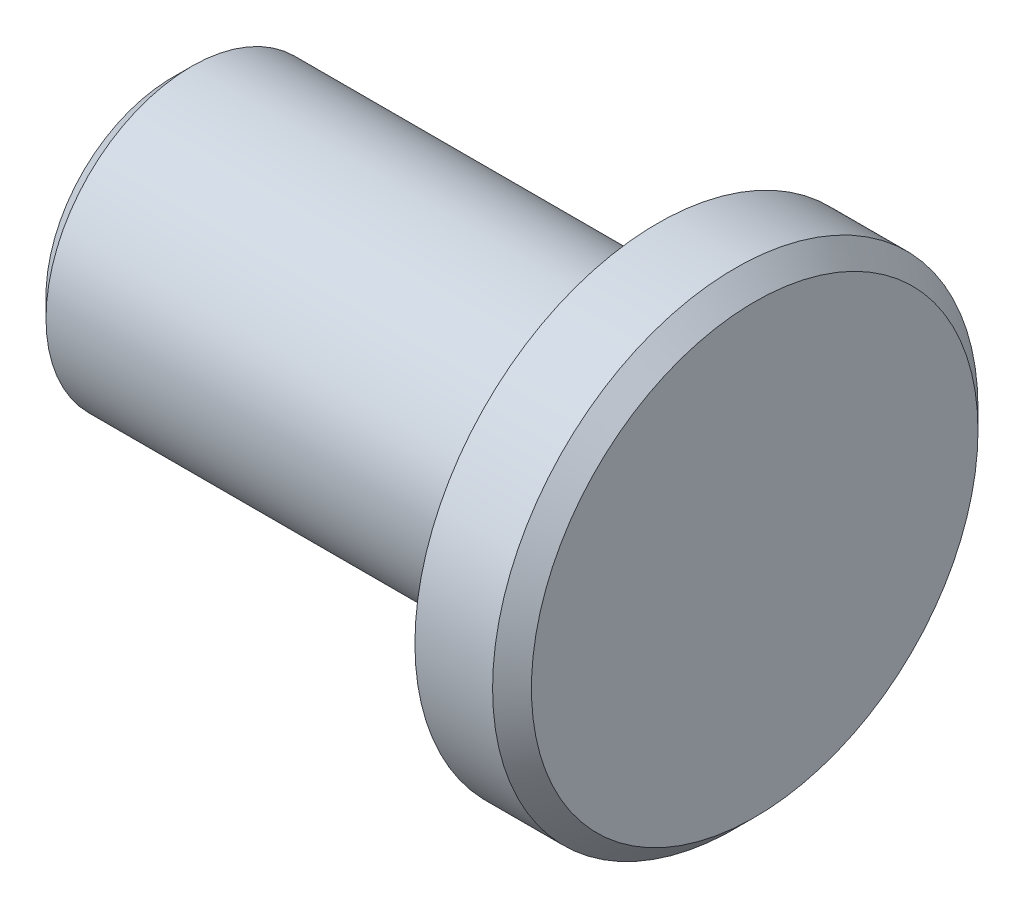
ISO-10303-21;
HEADER;
FILE_DESCRIPTION(('STEP AP214'),'2;1');
FILE_NAME('part.step','',(''),(''),'','','');
FILE_SCHEMA(('AUTOMOTIVE_DESIGN { 1 0 10303 214 1 1 1 1 }'));
ENDSEC;
DATA;
#1=APPLICATION_CONTEXT('core data for automotive mechanical design processes');
#2=APPLICATION_PROTOCOL_DEFINITION('international standard','automotive_design',2000,#1);
#3=PRODUCT_CONTEXT('',#1,'mechanical');
#4=PRODUCT('Part','Part','',(#3));
#5=PRODUCT_RELATED_PRODUCT_CATEGORY('part','',(#4));
#6=PRODUCT_DEFINITION_FORMATION('','',#4);
#7=PRODUCT_DEFINITION_CONTEXT('part definition',#1,'design');
#8=PRODUCT_DEFINITION('design','',#6,#7);
#9=PRODUCT_DEFINITION_SHAPE('','',#8);
#10=(LENGTH_UNIT() NAMED_UNIT(*) SI_UNIT(.MILLI.,.METRE.));
#11=(NAMED_UNIT(*) PLANE_ANGLE_UNIT() SI_UNIT($,.RADIAN.));
#12=(NAMED_UNIT(*) SI_UNIT($,.STERADIAN.) SOLID_ANGLE_UNIT());
#13=UNCERTAINTY_MEASURE_WITH_UNIT(LENGTH_MEASURE(1.E-05),#10,'distance_accuracy_value','');
#14=(GEOMETRIC_REPRESENTATION_CONTEXT(3) GLOBAL_UNCERTAINTY_ASSIGNED_CONTEXT((#13)) GLOBAL_UNIT_ASSIGNED_CONTEXT((#10,
#11,#12)) REPRESENTATION_CONTEXT('',''));
#15=CARTESIAN_POINT('',(0.,0.,0.));
#16=DIRECTION('',(0.,0.,1.));
#17=DIRECTION('',(1.,0.,0.));
#18=AXIS2_PLACEMENT_3D('',#15,#16,#17);
#19=CARTESIAN_POINT('',(5.,0.,0.));
#20=DIRECTION('',(-1.,0.,0.));
#21=DIRECTION('',(0.,0.,1.));
#22=AXIS2_PLACEMENT_3D('',#19,#20,#21);
#23=CYLINDRICAL_SURFACE('',#22,1.5);
#24=CARTESIAN_POINT('',(0.199999999999998,0.,0.));
#25=DIRECTION('',(1.,0.,0.));
#26=DIRECTION('',(0.,0.,-1.));
#27=AXIS2_PLACEMENT_3D('',#24,#25,#26);
#28=CIRCLE('',#27,1.5);
#29=CARTESIAN_POINT('',(0.199999999999998,0.,-1.5));
#30=VERTEX_POINT('',#29);
#31=EDGE_CURVE('E51',#30,#30,#28,.T.);
#32=ORIENTED_EDGE('',*,*,#31,.T.);
#33=EDGE_LOOP('',(#32));
#34=FACE_BOUND('',#33,.T.);
#35=CARTESIAN_POINT('',(5.,0.,0.));
#36=DIRECTION('',(1.,0.,0.));
#37=DIRECTION('',(0.,0.,-1.));
#38=AXIS2_PLACEMENT_3D('',#35,#36,#37);
#39=CIRCLE('',#38,1.5);
#40=CARTESIAN_POINT('',(5.,0.,-1.5));
#41=VERTEX_POINT('',#40);
#42=EDGE_CURVE('E56',#41,#41,#39,.T.);
#43=ORIENTED_EDGE('',*,*,#42,.F.);
#44=EDGE_LOOP('',(#43));
#45=FACE_BOUND('',#44,.T.);
#46=ADVANCED_FACE('F35',(#34,#45),#23,.T.);
#47=CARTESIAN_POINT('',(0.,0.,0.));
#48=DIRECTION('',(1.,0.,0.));
#49=DIRECTION('',(0.,0.,-1.));
#50=AXIS2_PLACEMENT_3D('',#47,#48,#49);
#51=PLANE('',#50);
#52=CARTESIAN_POINT('',(0.,0.,0.));
#53=DIRECTION('',(1.,0.,0.));
#54=DIRECTION('',(0.,0.,-1.));
#55=AXIS2_PLACEMENT_3D('',#52,#53,#54);
#56=CIRCLE('',#55,1.3);
#57=CARTESIAN_POINT('',(0.,0.,-1.3));
#58=VERTEX_POINT('',#57);
#59=EDGE_CURVE('E47',#58,#58,#56,.F.);
#60=ORIENTED_EDGE('',*,*,#59,.T.);
#61=EDGE_LOOP('',(#60));
#62=FACE_BOUND('',#61,.T.);
#63=ADVANCED_FACE('F79',(#62),#51,.F.);
#64=CARTESIAN_POINT('',(6.,0.,0.));
#65=DIRECTION('',(-1.,0.,0.));
#66=DIRECTION('',(0.,0.,1.));
#67=AXIS2_PLACEMENT_3D('',#64,#65,#66);
#68=CYLINDRICAL_SURFACE('',#67,2.5);
#69=CARTESIAN_POINT('',(5.8,0.,0.));
#70=DIRECTION('',(1.,0.,0.));
#71=DIRECTION('',(0.,0.,-1.));
#72=AXIS2_PLACEMENT_3D('',#69,#70,#71);
#73=CIRCLE('',#72,2.5);
#74=CARTESIAN_POINT('',(5.8,0.,-2.5));
#75=VERTEX_POINT('',#74);
#76=EDGE_CURVE('E10',#75,#75,#73,.F.);
#77=ORIENTED_EDGE('',*,*,#76,.T.);
#78=EDGE_LOOP('',(#77));
#79=FACE_BOUND('',#78,.T.);
#80=CARTESIAN_POINT('',(5.,0.,0.));
#81=DIRECTION('',(1.,0.,0.));
#82=DIRECTION('',(0.,0.,-1.));
#83=AXIS2_PLACEMENT_3D('',#80,#81,#82);
#84=CIRCLE('',#83,2.5);
#85=CARTESIAN_POINT('',(5.,0.,-2.5));
#86=VERTEX_POINT('',#85);
#87=EDGE_CURVE('E59',#86,#86,#84,.T.);
#88=ORIENTED_EDGE('',*,*,#87,.T.);
#89=EDGE_LOOP('',(#88));
#90=FACE_BOUND('',#89,.T.);
#91=ADVANCED_FACE('F63',(#79,#90),#68,.T.);
#92=CARTESIAN_POINT('',(6.,0.,0.));
#93=DIRECTION('',(1.,0.,0.));
#94=DIRECTION('',(0.,0.,-1.));
#95=AXIS2_PLACEMENT_3D('',#92,#93,#94);
#96=PLANE('',#95);
#97=CARTESIAN_POINT('',(6.,0.,0.));
#98=DIRECTION('',(1.,0.,0.));
#99=DIRECTION('',(0.,0.,-1.));
#100=AXIS2_PLACEMENT_3D('',#97,#98,#99);
#101=CIRCLE('',#100,2.3);
#102=CARTESIAN_POINT('',(6.,0.,-2.3));
#103=VERTEX_POINT('',#102);
#104=EDGE_CURVE('E43',#103,#103,#101,.T.);
#105=ORIENTED_EDGE('',*,*,#104,.T.);
#106=EDGE_LOOP('',(#105));
#107=FACE_BOUND('',#106,.T.);
#108=ADVANCED_FACE('F68',(#107),#96,.T.);
#109=CARTESIAN_POINT('',(5.,0.,0.));
#110=DIRECTION('',(1.,0.,0.));
#111=DIRECTION('',(0.,0.,-1.));
#112=AXIS2_PLACEMENT_3D('',#109,#110,#111);
#113=PLANE('',#112);
#114=ORIENTED_EDGE('',*,*,#42,.T.);
#115=EDGE_LOOP('',(#114));
#116=FACE_BOUND('',#115,.T.);
#117=ORIENTED_EDGE('',*,*,#87,.F.);
#118=EDGE_LOOP('',(#117));
#119=FACE_BOUND('',#118,.T.);
#120=ADVANCED_FACE('F65',(#116,#119),#113,.F.);
#121=CARTESIAN_POINT('',(0.199999999999998,0.,0.));
#122=DIRECTION('',(1.,0.,0.));
#123=DIRECTION('',(0.,0.,-1.));
#124=AXIS2_PLACEMENT_3D('',#121,#122,#123);
#125=CONICAL_SURFACE('',#124,1.5,0.785398163397452);
#126=ORIENTED_EDGE('',*,*,#59,.F.);
#127=EDGE_LOOP('',(#126));
#128=FACE_BOUND('',#127,.T.);
#129=ORIENTED_EDGE('',*,*,#31,.F.);
#130=EDGE_LOOP('',(#129));
#131=FACE_BOUND('',#130,.T.);
#132=ADVANCED_FACE('F67',(#128,#131),#125,.T.);
#133=CARTESIAN_POINT('',(6.,0.,0.));
#134=DIRECTION('',(-1.,0.,0.));
#135=DIRECTION('',(0.,0.,1.));
#136=AXIS2_PLACEMENT_3D('',#133,#134,#135);
#137=CONICAL_SURFACE('',#136,2.3,0.785398163397443);
#138=ORIENTED_EDGE('',*,*,#76,.F.);
#139=EDGE_LOOP('',(#138));
#140=FACE_BOUND('',#139,.T.);
#141=ORIENTED_EDGE('',*,*,#104,.F.);
#142=EDGE_LOOP('',(#141));
#143=FACE_BOUND('',#142,.T.);
#144=ADVANCED_FACE('F38',(#140,#143),#137,.T.);
#145=CLOSED_SHELL('',(#46,#63,#91,#108,#120,#132,#144));
#146=MANIFOLD_SOLID_BREP('B2',#145);
#147=ADVANCED_BREP_SHAPE_REPRESENTATION('',(#18,#146),#14);
#148=SHAPE_DEFINITION_REPRESENTATION(#9,#147);
ENDSEC;
END-ISO-10303-21;
